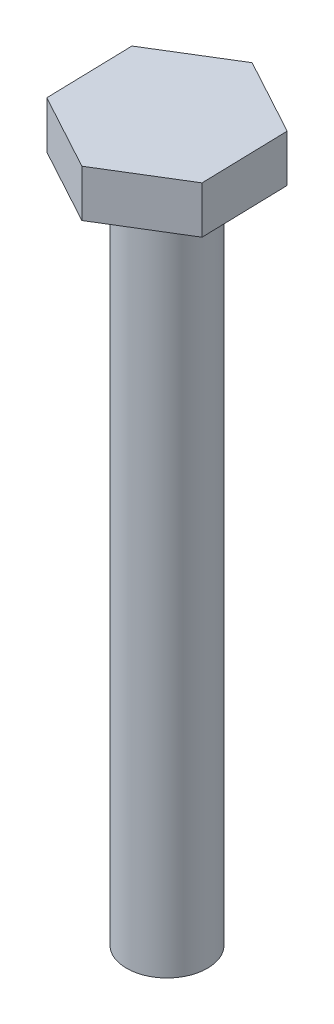
ISO-10303-21;
HEADER;
FILE_DESCRIPTION(('STEP AP214'),'2;1');
FILE_NAME('part.step','',(''),(''),'','','');
FILE_SCHEMA(('AUTOMOTIVE_DESIGN { 1 0 10303 214 1 1 1 1 }'));
ENDSEC;
DATA;
#1=APPLICATION_CONTEXT('core data for automotive mechanical design processes');
#2=APPLICATION_PROTOCOL_DEFINITION('international standard','automotive_design',2000,#1);
#3=PRODUCT_CONTEXT('',#1,'mechanical');
#4=PRODUCT('Part','Part','',(#3));
#5=PRODUCT_RELATED_PRODUCT_CATEGORY('part','',(#4));
#6=PRODUCT_DEFINITION_FORMATION('','',#4);
#7=PRODUCT_DEFINITION_CONTEXT('part definition',#1,'design');
#8=PRODUCT_DEFINITION('design','',#6,#7);
#9=PRODUCT_DEFINITION_SHAPE('','',#8);
#10=(LENGTH_UNIT() NAMED_UNIT(*) SI_UNIT(.MILLI.,.METRE.));
#11=(NAMED_UNIT(*) PLANE_ANGLE_UNIT() SI_UNIT($,.RADIAN.));
#12=(NAMED_UNIT(*) SI_UNIT($,.STERADIAN.) SOLID_ANGLE_UNIT());
#13=UNCERTAINTY_MEASURE_WITH_UNIT(LENGTH_MEASURE(1.E-05),#10,'distance_accuracy_value','');
#14=(GEOMETRIC_REPRESENTATION_CONTEXT(3) GLOBAL_UNCERTAINTY_ASSIGNED_CONTEXT((#13)) GLOBAL_UNIT_ASSIGNED_CONTEXT((#10,
#11,#12)) REPRESENTATION_CONTEXT('',''));
#15=CARTESIAN_POINT('',(0.,0.,0.));
#16=DIRECTION('',(0.,0.,1.));
#17=DIRECTION('',(1.,0.,0.));
#18=AXIS2_PLACEMENT_3D('',#15,#16,#17);
#19=CARTESIAN_POINT('',(-0.167873016872767,3.5,-6.49783184225368));
#20=DIRECTION('',(-0.477466711370013,0.,0.878649838976543));
#21=DIRECTION('',(-0.878649838976543,0.,-0.477466711370013));
#22=AXIS2_PLACEMENT_3D('',#19,#20,#21);
#23=PLANE('',#22);
#24=DIRECTION('',(0.878649838976543,0.,0.477466711370013));
#25=VECTOR('',#24,1.);
#26=CARTESIAN_POINT('',(-0.167873016872767,0.,-6.49783184225368));
#27=LINE('',#26,#25);
#28=CARTESIAN_POINT('',(-0.167873016872767,0.,-6.49783184225368));
#29=VERTEX_POINT('',#28);
#30=CARTESIAN_POINT('',(5.54335093647476,0.,-3.3942982183486));
#31=VERTEX_POINT('',#30);
#32=EDGE_CURVE('E120',#29,#31,#27,.T.);
#33=ORIENTED_EDGE('',*,*,#32,.F.);
#34=DIRECTION('',(0.,-1.,0.));
#35=VECTOR('',#34,1.);
#36=CARTESIAN_POINT('',(-0.167873016872767,3.5,-6.49783184225368));
#37=LINE('',#36,#35);
#38=CARTESIAN_POINT('',(-0.167873016872767,3.5,-6.49783184225368));
#39=VERTEX_POINT('',#38);
#40=EDGE_CURVE('E119',#39,#29,#37,.T.);
#41=ORIENTED_EDGE('',*,*,#40,.F.);
#42=DIRECTION('',(0.878649838976543,0.,0.477466711370013));
#43=VECTOR('',#42,1.);
#44=CARTESIAN_POINT('',(-0.167873016872767,3.5,-6.49783184225368));
#45=LINE('',#44,#43);
#46=CARTESIAN_POINT('',(5.54335093647476,3.5,-3.3942982183486));
#47=VERTEX_POINT('',#46);
#48=EDGE_CURVE('E133',#39,#47,#45,.T.);
#49=ORIENTED_EDGE('',*,*,#48,.T.);
#50=DIRECTION('',(0.,-1.,0.));
#51=VECTOR('',#50,1.);
#52=CARTESIAN_POINT('',(5.54335093647476,3.5,-3.3942982183486));
#53=LINE('',#52,#51);
#54=EDGE_CURVE('E45',#47,#31,#53,.T.);
#55=ORIENTED_EDGE('',*,*,#54,.T.);
#56=EDGE_LOOP('',(#33,#41,#49,#55));
#57=FACE_BOUND('',#56,.T.);
#58=ADVANCED_FACE('F37',(#57),#23,.F.);
#59=CARTESIAN_POINT('',(5.54335093647476,3.5,-3.3942982183486));
#60=DIRECTION('',(-0.999666437269799,0.,0.0258266179804261));
#61=DIRECTION('',(-0.0258266179804261,0.,-0.999666437269799));
#62=AXIS2_PLACEMENT_3D('',#59,#60,#61);
#63=PLANE('',#62);
#64=DIRECTION('',(0.0258266179804261,0.,0.999666437269799));
#65=VECTOR('',#64,1.);
#66=CARTESIAN_POINT('',(5.54335093647476,0.,-3.3942982183486));
#67=LINE('',#66,#65);
#68=CARTESIAN_POINT('',(5.71122395334753,0.,3.10353362390509));
#69=VERTEX_POINT('',#68);
#70=EDGE_CURVE('E122',#31,#69,#67,.T.);
#71=ORIENTED_EDGE('',*,*,#70,.F.);
#72=ORIENTED_EDGE('',*,*,#54,.F.);
#73=DIRECTION('',(0.0258266179804261,0.,0.999666437269799));
#74=VECTOR('',#73,1.);
#75=CARTESIAN_POINT('',(5.54335093647476,3.5,-3.3942982183486));
#76=LINE('',#75,#74);
#77=CARTESIAN_POINT('',(5.71122395334753,3.5,3.10353362390509));
#78=VERTEX_POINT('',#77);
#79=EDGE_CURVE('E85',#47,#78,#76,.T.);
#80=ORIENTED_EDGE('',*,*,#79,.T.);
#81=DIRECTION('',(0.,-1.,0.));
#82=VECTOR('',#81,1.);
#83=CARTESIAN_POINT('',(5.71122395334753,3.5,3.10353362390509));
#84=LINE('',#83,#82);
#85=EDGE_CURVE('E137',#78,#69,#84,.T.);
#86=ORIENTED_EDGE('',*,*,#85,.T.);
#87=EDGE_LOOP('',(#71,#72,#80,#86));
#88=FACE_BOUND('',#87,.T.);
#89=ADVANCED_FACE('F146',(#88),#63,.F.);
#90=CARTESIAN_POINT('',(5.71122395334753,3.5,3.10353362390509));
#91=DIRECTION('',(-0.522199725899786,0.,-0.852823220996115));
#92=DIRECTION('',(0.852823220996115,0.,-0.522199725899786));
#93=AXIS2_PLACEMENT_3D('',#90,#91,#92);
#94=PLANE('',#93);
#95=DIRECTION('',(-0.852823220996115,0.,0.522199725899786));
#96=VECTOR('',#95,1.);
#97=CARTESIAN_POINT('',(5.71122395334753,0.,3.10353362390509));
#98=LINE('',#97,#96);
#99=CARTESIAN_POINT('',(0.167873016872779,0.,6.49783184225369));
#100=VERTEX_POINT('',#99);
#101=EDGE_CURVE('E126',#69,#100,#98,.T.);
#102=ORIENTED_EDGE('',*,*,#101,.F.);
#103=ORIENTED_EDGE('',*,*,#85,.F.);
#104=DIRECTION('',(-0.852823220996115,0.,0.522199725899786));
#105=VECTOR('',#104,1.);
#106=CARTESIAN_POINT('',(5.71122395334753,3.5,3.10353362390509));
#107=LINE('',#106,#105);
#108=CARTESIAN_POINT('',(0.167873016872779,3.5,6.49783184225369));
#109=VERTEX_POINT('',#108);
#110=EDGE_CURVE('E113',#78,#109,#107,.T.);
#111=ORIENTED_EDGE('',*,*,#110,.T.);
#112=DIRECTION('',(0.,-1.,0.));
#113=VECTOR('',#112,1.);
#114=CARTESIAN_POINT('',(0.167873016872779,3.5,6.49783184225369));
#115=LINE('',#114,#113);
#116=EDGE_CURVE('E107',#109,#100,#115,.T.);
#117=ORIENTED_EDGE('',*,*,#116,.T.);
#118=EDGE_LOOP('',(#102,#103,#111,#117));
#119=FACE_BOUND('',#118,.T.);
#120=ADVANCED_FACE('F149',(#119),#94,.F.);
#121=CARTESIAN_POINT('',(0.167873016872779,3.5,6.49783184225369));
#122=DIRECTION('',(0.477466711370013,0.,-0.878649838976543));
#123=DIRECTION('',(0.878649838976543,0.,0.477466711370013));
#124=AXIS2_PLACEMENT_3D('',#121,#122,#123);
#125=PLANE('',#124);
#126=DIRECTION('',(-0.878649838976543,0.,-0.477466711370013));
#127=VECTOR('',#126,1.);
#128=CARTESIAN_POINT('',(0.167873016872779,0.,6.49783184225369));
#129=LINE('',#128,#127);
#130=CARTESIAN_POINT('',(-5.54335093647474,0.,3.39429821834861));
#131=VERTEX_POINT('',#130);
#132=EDGE_CURVE('E129',#100,#131,#129,.T.);
#133=ORIENTED_EDGE('',*,*,#132,.F.);
#134=ORIENTED_EDGE('',*,*,#116,.F.);
#135=DIRECTION('',(-0.878649838976543,0.,-0.477466711370013));
#136=VECTOR('',#135,1.);
#137=CARTESIAN_POINT('',(0.167873016872779,3.5,6.49783184225369));
#138=LINE('',#137,#136);
#139=CARTESIAN_POINT('',(-5.54335093647474,3.5,3.39429821834861));
#140=VERTEX_POINT('',#139);
#141=EDGE_CURVE('E97',#109,#140,#138,.T.);
#142=ORIENTED_EDGE('',*,*,#141,.T.);
#143=DIRECTION('',(0.,-1.,0.));
#144=VECTOR('',#143,1.);
#145=CARTESIAN_POINT('',(-5.54335093647474,3.5,3.39429821834861));
#146=LINE('',#145,#144);
#147=EDGE_CURVE('E102',#140,#131,#146,.T.);
#148=ORIENTED_EDGE('',*,*,#147,.T.);
#149=EDGE_LOOP('',(#133,#134,#142,#148));
#150=FACE_BOUND('',#149,.T.);
#151=ADVANCED_FACE('F110',(#150),#125,.F.);
#152=CARTESIAN_POINT('',(-5.54335093647474,3.5,3.39429821834861));
#153=DIRECTION('',(0.999666437269799,0.,-0.0258266179804277));
#154=DIRECTION('',(0.0258266179804277,0.,0.999666437269799));
#155=AXIS2_PLACEMENT_3D('',#152,#153,#154);
#156=PLANE('',#155);
#157=DIRECTION('',(-0.0258266179804277,0.,-0.999666437269799));
#158=VECTOR('',#157,1.);
#159=CARTESIAN_POINT('',(-5.54335093647474,0.,3.39429821834861));
#160=LINE('',#159,#158);
#161=CARTESIAN_POINT('',(-5.71122395334752,0.,-3.10353362390507));
#162=VERTEX_POINT('',#161);
#163=EDGE_CURVE('E104',#131,#162,#160,.T.);
#164=ORIENTED_EDGE('',*,*,#163,.F.);
#165=ORIENTED_EDGE('',*,*,#147,.F.);
#166=DIRECTION('',(-0.0258266179804277,0.,-0.999666437269799));
#167=VECTOR('',#166,1.);
#168=CARTESIAN_POINT('',(-5.54335093647474,3.5,3.39429821834861));
#169=LINE('',#168,#167);
#170=CARTESIAN_POINT('',(-5.71122395334752,3.5,-3.10353362390507));
#171=VERTEX_POINT('',#170);
#172=EDGE_CURVE('E93',#140,#171,#169,.T.);
#173=ORIENTED_EDGE('',*,*,#172,.T.);
#174=DIRECTION('',(0.,-1.,0.));
#175=VECTOR('',#174,1.);
#176=CARTESIAN_POINT('',(-5.71122395334752,3.5,-3.10353362390507));
#177=LINE('',#176,#175);
#178=EDGE_CURVE('E108',#171,#162,#177,.T.);
#179=ORIENTED_EDGE('',*,*,#178,.T.);
#180=EDGE_LOOP('',(#164,#165,#173,#179));
#181=FACE_BOUND('',#180,.T.);
#182=ADVANCED_FACE('F103',(#181),#156,.F.);
#183=CARTESIAN_POINT('',(-5.71122395334752,3.5,-3.10353362390507));
#184=DIRECTION('',(0.522199725899786,0.,0.852823220996115));
#185=DIRECTION('',(-0.852823220996115,0.,0.522199725899786));
#186=AXIS2_PLACEMENT_3D('',#183,#184,#185);
#187=PLANE('',#186);
#188=DIRECTION('',(0.852823220996115,0.,-0.522199725899786));
#189=VECTOR('',#188,1.);
#190=CARTESIAN_POINT('',(-5.71122395334752,0.,-3.10353362390507));
#191=LINE('',#190,#189);
#192=EDGE_CURVE('E73',#162,#29,#191,.T.);
#193=ORIENTED_EDGE('',*,*,#192,.F.);
#194=ORIENTED_EDGE('',*,*,#178,.F.);
#195=DIRECTION('',(0.852823220996115,0.,-0.522199725899786));
#196=VECTOR('',#195,1.);
#197=CARTESIAN_POINT('',(-5.71122395334752,3.5,-3.10353362390507));
#198=LINE('',#197,#196);
#199=EDGE_CURVE('E53',#171,#39,#198,.T.);
#200=ORIENTED_EDGE('',*,*,#199,.T.);
#201=ORIENTED_EDGE('',*,*,#40,.T.);
#202=EDGE_LOOP('',(#193,#194,#200,#201));
#203=FACE_BOUND('',#202,.T.);
#204=ADVANCED_FACE('F183',(#203),#187,.F.);
#205=CARTESIAN_POINT('',(0.,3.5,0.));
#206=DIRECTION('',(0.,1.,0.));
#207=DIRECTION('',(0.,0.,-1.));
#208=AXIS2_PLACEMENT_3D('',#205,#206,#207);
#209=PLANE('',#208);
#210=ORIENTED_EDGE('',*,*,#48,.F.);
#211=ORIENTED_EDGE('',*,*,#199,.F.);
#212=ORIENTED_EDGE('',*,*,#172,.F.);
#213=ORIENTED_EDGE('',*,*,#141,.F.);
#214=ORIENTED_EDGE('',*,*,#110,.F.);
#215=ORIENTED_EDGE('',*,*,#79,.F.);
#216=EDGE_LOOP('',(#210,#211,#212,#213,#214,#215));
#217=FACE_BOUND('',#216,.T.);
#218=ADVANCED_FACE('F95',(#217),#209,.T.);
#219=CARTESIAN_POINT('',(0.,0.,0.));
#220=DIRECTION('',(0.,1.,0.));
#221=DIRECTION('',(0.,0.,-1.));
#222=AXIS2_PLACEMENT_3D('',#219,#220,#221);
#223=PLANE('',#222);
#224=CARTESIAN_POINT('',(0.,0.,0.));
#225=DIRECTION('',(0.,-1.,0.));
#226=DIRECTION('',(0.,0.,-1.));
#227=AXIS2_PLACEMENT_3D('',#224,#225,#226);
#228=CIRCLE('',#227,3.);
#229=CARTESIAN_POINT('',(0.,0.,-3.));
#230=VERTEX_POINT('',#229);
#231=EDGE_CURVE('E11',#230,#230,#228,.F.);
#232=ORIENTED_EDGE('',*,*,#231,.T.);
#233=EDGE_LOOP('',(#232));
#234=FACE_BOUND('',#233,.T.);
#235=ORIENTED_EDGE('',*,*,#32,.T.);
#236=ORIENTED_EDGE('',*,*,#70,.T.);
#237=ORIENTED_EDGE('',*,*,#101,.T.);
#238=ORIENTED_EDGE('',*,*,#132,.T.);
#239=ORIENTED_EDGE('',*,*,#163,.T.);
#240=ORIENTED_EDGE('',*,*,#192,.T.);
#241=EDGE_LOOP('',(#235,#236,#237,#238,#239,#240));
#242=FACE_BOUND('',#241,.T.);
#243=ADVANCED_FACE('F145',(#234,#242),#223,.F.);
#244=CARTESIAN_POINT('',(0.,-50.,0.));
#245=DIRECTION('',(0.,1.,0.));
#246=DIRECTION('',(0.,0.,-1.));
#247=AXIS2_PLACEMENT_3D('',#244,#245,#246);
#248=CYLINDRICAL_SURFACE('',#247,3.);
#249=CARTESIAN_POINT('',(0.,-50.,0.));
#250=DIRECTION('',(0.,1.,0.));
#251=DIRECTION('',(0.,0.,1.));
#252=AXIS2_PLACEMENT_3D('',#249,#250,#251);
#253=CIRCLE('',#252,3.);
#254=CARTESIAN_POINT('',(0.,-50.,3.));
#255=VERTEX_POINT('',#254);
#256=EDGE_CURVE('E123',#255,#255,#253,.T.);
#257=ORIENTED_EDGE('',*,*,#256,.T.);
#258=EDGE_LOOP('',(#257));
#259=FACE_BOUND('',#258,.T.);
#260=ORIENTED_EDGE('',*,*,#231,.F.);
#261=EDGE_LOOP('',(#260));
#262=FACE_BOUND('',#261,.T.);
#263=ADVANCED_FACE('F208',(#259,#262),#248,.T.);
#264=CARTESIAN_POINT('',(0.,-50.,0.));
#265=DIRECTION('',(0.,-1.,0.));
#266=DIRECTION('',(0.,0.,1.));
#267=AXIS2_PLACEMENT_3D('',#264,#265,#266);
#268=PLANE('',#267);
#269=ORIENTED_EDGE('',*,*,#256,.F.);
#270=EDGE_LOOP('',(#269));
#271=FACE_BOUND('',#270,.T.);
#272=ADVANCED_FACE('F218',(#271),#268,.T.);
#273=CLOSED_SHELL('',(#58,#89,#120,#151,#182,#204,#218,#243,#263,#272));
#274=MANIFOLD_SOLID_BREP('B2',#273);
#275=ADVANCED_BREP_SHAPE_REPRESENTATION('',(#18,#274),#14);
#276=SHAPE_DEFINITION_REPRESENTATION(#9,#275);
ENDSEC;
END-ISO-10303-21;
